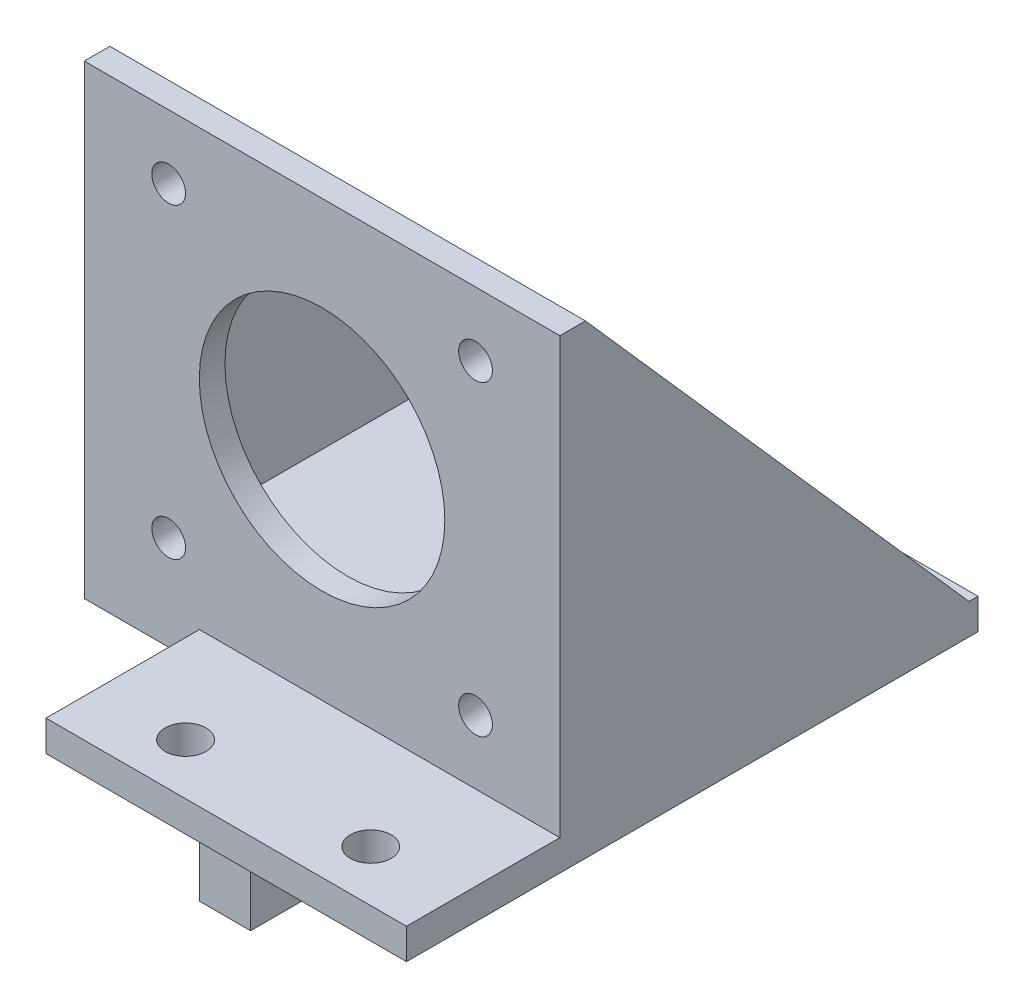
ISO-10303-21;
HEADER;
FILE_DESCRIPTION(('STEP AP214'),'2;1');
FILE_NAME('part.step','',(''),(''),'','','');
FILE_SCHEMA(('AUTOMOTIVE_DESIGN { 1 0 10303 214 1 1 1 1 }'));
ENDSEC;
DATA;
#1=APPLICATION_CONTEXT('core data for automotive mechanical design processes');
#2=APPLICATION_PROTOCOL_DEFINITION('international standard','automotive_design',2000,#1);
#3=PRODUCT_CONTEXT('',#1,'mechanical');
#4=PRODUCT('Part','Part','',(#3));
#5=PRODUCT_RELATED_PRODUCT_CATEGORY('part','',(#4));
#6=PRODUCT_DEFINITION_FORMATION('','',#4);
#7=PRODUCT_DEFINITION_CONTEXT('part definition',#1,'design');
#8=PRODUCT_DEFINITION('design','',#6,#7);
#9=PRODUCT_DEFINITION_SHAPE('','',#8);
#10=(LENGTH_UNIT() NAMED_UNIT(*) SI_UNIT(.MILLI.,.METRE.));
#11=(NAMED_UNIT(*) PLANE_ANGLE_UNIT() SI_UNIT($,.RADIAN.));
#12=(NAMED_UNIT(*) SI_UNIT($,.STERADIAN.) SOLID_ANGLE_UNIT());
#13=UNCERTAINTY_MEASURE_WITH_UNIT(LENGTH_MEASURE(1.E-05),#10,'distance_accuracy_value','');
#14=(GEOMETRIC_REPRESENTATION_CONTEXT(3) GLOBAL_UNCERTAINTY_ASSIGNED_CONTEXT((#13)) GLOBAL_UNIT_ASSIGNED_CONTEXT((#10,
#11,#12)) REPRESENTATION_CONTEXT('',''));
#15=CARTESIAN_POINT('',(0.,0.,0.));
#16=DIRECTION('',(0.,0.,1.));
#17=DIRECTION('',(1.,0.,0.));
#18=AXIS2_PLACEMENT_3D('',#15,#16,#17);
#19=CARTESIAN_POINT('',(0.,0.,0.));
#20=DIRECTION('',(0.,1.,0.));
#21=DIRECTION('',(0.,0.,1.));
#22=AXIS2_PLACEMENT_3D('',#19,#20,#21);
#23=PLANE('',#22);
#24=CARTESIAN_POINT('',(46.0093587866197,0.,9.99999999999999));
#25=DIRECTION('',(0.,1.,0.));
#26=DIRECTION('',(0.,0.,1.));
#27=AXIS2_PLACEMENT_3D('',#24,#25,#26);
#28=CIRCLE('',#27,2.);
#29=CARTESIAN_POINT('',(46.0093587866197,0.,12.));
#30=VERTEX_POINT('',#29);
#31=EDGE_CURVE('E264',#30,#30,#28,.T.);
#32=ORIENTED_EDGE('',*,*,#31,.T.);
#33=EDGE_LOOP('',(#32));
#34=FACE_BOUND('',#33,.T.);
#35=CARTESIAN_POINT('',(27.9041713133239,0.,9.99999999999999));
#36=DIRECTION('',(0.,1.,0.));
#37=DIRECTION('',(0.,0.,1.));
#38=AXIS2_PLACEMENT_3D('',#35,#36,#37);
#39=CIRCLE('',#38,2.);
#40=CARTESIAN_POINT('',(27.9041713133239,0.,12.));
#41=VERTEX_POINT('',#40);
#42=EDGE_CURVE('E239',#41,#41,#39,.T.);
#43=ORIENTED_EDGE('',*,*,#42,.T.);
#44=EDGE_LOOP('',(#43));
#45=FACE_BOUND('',#44,.T.);
#46=DIRECTION('',(0.,0.,1.));
#47=VECTOR('',#46,1.);
#48=CARTESIAN_POINT('',(24.259624399256,0.,-40.8749162367315));
#49=LINE('',#48,#47);
#50=CARTESIAN_POINT('',(24.259624399256,0.,-40.8749162367315));
#51=VERTEX_POINT('',#50);
#52=CARTESIAN_POINT('',(24.259624399256,0.,0.));
#53=VERTEX_POINT('',#52);
#54=EDGE_CURVE('E170',#51,#53,#49,.T.);
#55=ORIENTED_EDGE('',*,*,#54,.F.);
#56=DIRECTION('',(-1.,0.,0.));
#57=VECTOR('',#56,1.);
#58=CARTESIAN_POINT('',(0.,0.,-40.8749162367315));
#59=LINE('',#58,#57);
#60=CARTESIAN_POINT('',(54.5,0.,-40.8749162367315));
#61=VERTEX_POINT('',#60);
#62=EDGE_CURVE('E278',#61,#51,#59,.T.);
#63=ORIENTED_EDGE('',*,*,#62,.F.);
#64=DIRECTION('',(0.,0.,1.));
#65=VECTOR('',#64,1.);
#66=CARTESIAN_POINT('',(54.5,0.,0.));
#67=LINE('',#66,#65);
#68=CARTESIAN_POINT('',(54.5,0.,15.));
#69=VERTEX_POINT('',#68);
#70=EDGE_CURVE('E275',#61,#69,#67,.T.);
#71=ORIENTED_EDGE('',*,*,#70,.T.);
#72=DIRECTION('',(-1.,0.,0.));
#73=VECTOR('',#72,1.);
#74=CARTESIAN_POINT('',(0.,0.,15.));
#75=LINE('',#74,#73);
#76=CARTESIAN_POINT('',(19.259624399256,0.,15.));
#77=VERTEX_POINT('',#76);
#78=EDGE_CURVE('E272',#69,#77,#75,.T.);
#79=ORIENTED_EDGE('',*,*,#78,.T.);
#80=DIRECTION('',(0.,0.,1.));
#81=VECTOR('',#80,1.);
#82=CARTESIAN_POINT('',(19.259624399256,0.,0.));
#83=LINE('',#82,#81);
#84=CARTESIAN_POINT('',(19.259624399256,0.,0.));
#85=VERTEX_POINT('',#84);
#86=EDGE_CURVE('E269',#85,#77,#83,.T.);
#87=ORIENTED_EDGE('',*,*,#86,.F.);
#88=DIRECTION('',(-1.,0.,0.));
#89=VECTOR('',#88,1.);
#90=CARTESIAN_POINT('',(24.259624399256,0.,0.));
#91=LINE('',#90,#89);
#92=EDGE_CURVE('E52',#53,#85,#91,.T.);
#93=ORIENTED_EDGE('',*,*,#92,.F.);
#94=EDGE_LOOP('',(#55,#63,#71,#79,#87,#93));
#95=FACE_BOUND('',#94,.T.);
#96=ADVANCED_FACE('F35',(#34,#45,#95),#23,.F.);
#97=DIRECTION('',(0.,0.,-1.));
#98=VECTOR('',#97,1.);
#99=CARTESIAN_POINT('',(19.259624399256,0.,-40.8749162367315));
#100=LINE('',#99,#98);
#101=CARTESIAN_POINT('',(19.259624399256,0.,-40.8749162367315));
#102=VERTEX_POINT('',#101);
#103=EDGE_CURVE('E167',#85,#102,#100,.T.);
#104=ORIENTED_EDGE('',*,*,#103,.F.);
#105=DIRECTION('',(1.,0.,0.));
#106=VECTOR('',#105,1.);
#107=CARTESIAN_POINT('',(0.,0.,0.));
#108=LINE('',#107,#106);
#109=CARTESIAN_POINT('',(8.,0.,0.));
#110=VERTEX_POINT('',#109);
#111=EDGE_CURVE('E267',#110,#85,#108,.T.);
#112=ORIENTED_EDGE('',*,*,#111,.F.);
#113=DIRECTION('',(0.,0.,-1.));
#114=VECTOR('',#113,1.);
#115=CARTESIAN_POINT('',(8.,0.,0.));
#116=LINE('',#115,#114);
#117=CARTESIAN_POINT('',(8.,0.,-40.8749162367315));
#118=VERTEX_POINT('',#117);
#119=EDGE_CURVE('E244',#110,#118,#116,.T.);
#120=ORIENTED_EDGE('',*,*,#119,.T.);
#121=EDGE_CURVE('E60',#102,#118,#59,.T.);
#122=ORIENTED_EDGE('',*,*,#121,.F.);
#123=EDGE_LOOP('',(#104,#112,#120,#122));
#124=FACE_BOUND('',#123,.T.);
#125=ADVANCED_FACE('F339',(#124),#23,.F.);
#126=CARTESIAN_POINT('',(0.,3.,0.));
#127=DIRECTION('',(0.,1.,0.));
#128=DIRECTION('',(0.,0.,1.));
#129=AXIS2_PLACEMENT_3D('',#126,#127,#128);
#130=PLANE('',#129);
#131=DIRECTION('',(1.,0.,0.));
#132=VECTOR('',#131,1.);
#133=CARTESIAN_POINT('',(0.,3.,0.));
#134=LINE('',#133,#132);
#135=CARTESIAN_POINT('',(19.259624399256,3.,0.));
#136=VERTEX_POINT('',#135);
#137=CARTESIAN_POINT('',(54.5,3.,0.));
#138=VERTEX_POINT('',#137);
#139=EDGE_CURVE('E44',#136,#138,#134,.T.);
#140=ORIENTED_EDGE('',*,*,#139,.F.);
#141=DIRECTION('',(0.,0.,1.));
#142=VECTOR('',#141,1.);
#143=CARTESIAN_POINT('',(19.259624399256,3.,0.));
#144=LINE('',#143,#142);
#145=CARTESIAN_POINT('',(19.259624399256,3.,15.));
#146=VERTEX_POINT('',#145);
#147=EDGE_CURVE('E247',#136,#146,#144,.T.);
#148=ORIENTED_EDGE('',*,*,#147,.T.);
#149=DIRECTION('',(-1.,0.,0.));
#150=VECTOR('',#149,1.);
#151=CARTESIAN_POINT('',(0.,3.,15.));
#152=LINE('',#151,#150);
#153=CARTESIAN_POINT('',(54.5,3.,15.));
#154=VERTEX_POINT('',#153);
#155=EDGE_CURVE('E249',#154,#146,#152,.T.);
#156=ORIENTED_EDGE('',*,*,#155,.F.);
#157=DIRECTION('',(0.,0.,1.));
#158=VECTOR('',#157,1.);
#159=CARTESIAN_POINT('',(54.5,3.,0.));
#160=LINE('',#159,#158);
#161=EDGE_CURVE('E252',#138,#154,#160,.T.);
#162=ORIENTED_EDGE('',*,*,#161,.F.);
#163=EDGE_LOOP('',(#140,#148,#156,#162));
#164=FACE_BOUND('',#163,.T.);
#165=CARTESIAN_POINT('',(27.9041713133239,3.,9.99999999999999));
#166=DIRECTION('',(0.,1.,0.));
#167=DIRECTION('',(0.,0.,1.));
#168=AXIS2_PLACEMENT_3D('',#165,#166,#167);
#169=CIRCLE('',#168,2.);
#170=CARTESIAN_POINT('',(27.9041713133239,3.,12.));
#171=VERTEX_POINT('',#170);
#172=EDGE_CURVE('E240',#171,#171,#169,.T.);
#173=ORIENTED_EDGE('',*,*,#172,.F.);
#174=EDGE_LOOP('',(#173));
#175=FACE_BOUND('',#174,.T.);
#176=CARTESIAN_POINT('',(46.0093587866197,3.,9.99999999999999));
#177=DIRECTION('',(0.,1.,0.));
#178=DIRECTION('',(0.,0.,1.));
#179=AXIS2_PLACEMENT_3D('',#176,#177,#178);
#180=CIRCLE('',#179,2.);
#181=CARTESIAN_POINT('',(46.0093587866197,3.,12.));
#182=VERTEX_POINT('',#181);
#183=EDGE_CURVE('E243',#182,#182,#180,.T.);
#184=ORIENTED_EDGE('',*,*,#183,.F.);
#185=EDGE_LOOP('',(#184));
#186=FACE_BOUND('',#185,.T.);
#187=ADVANCED_FACE('F409',(#164,#175,#186),#130,.T.);
#188=CARTESIAN_POINT('',(0.,3.,0.));
#189=DIRECTION('',(0.,0.,-1.));
#190=DIRECTION('',(-1.,0.,0.));
#191=AXIS2_PLACEMENT_3D('',#188,#189,#190);
#192=PLANE('',#191);
#193=CARTESIAN_POINT('',(16.25,9.25,0.));
#194=DIRECTION('',(0.,0.,1.));
#195=DIRECTION('',(1.,0.,0.));
#196=AXIS2_PLACEMENT_3D('',#193,#194,#195);
#197=CIRCLE('',#196,1.65);
#198=CARTESIAN_POINT('',(17.9,9.25,0.));
#199=VERTEX_POINT('',#198);
#200=EDGE_CURVE('E180',#199,#199,#197,.T.);
#201=ORIENTED_EDGE('',*,*,#200,.F.);
#202=EDGE_LOOP('',(#201));
#203=FACE_BOUND('',#202,.T.);
#204=CARTESIAN_POINT('',(16.25,39.25,0.));
#205=DIRECTION('',(0.,0.,1.));
#206=DIRECTION('',(1.,0.,0.));
#207=AXIS2_PLACEMENT_3D('',#204,#205,#206);
#208=CIRCLE('',#207,1.65);
#209=CARTESIAN_POINT('',(17.9,39.25,0.));
#210=VERTEX_POINT('',#209);
#211=EDGE_CURVE('E184',#210,#210,#208,.T.);
#212=ORIENTED_EDGE('',*,*,#211,.F.);
#213=EDGE_LOOP('',(#212));
#214=FACE_BOUND('',#213,.T.);
#215=CARTESIAN_POINT('',(46.25,39.25,0.));
#216=DIRECTION('',(0.,0.,1.));
#217=DIRECTION('',(1.,0.,0.));
#218=AXIS2_PLACEMENT_3D('',#215,#216,#217);
#219=CIRCLE('',#218,1.65);
#220=CARTESIAN_POINT('',(47.9,39.25,0.));
#221=VERTEX_POINT('',#220);
#222=EDGE_CURVE('E174',#221,#221,#219,.T.);
#223=ORIENTED_EDGE('',*,*,#222,.F.);
#224=EDGE_LOOP('',(#223));
#225=FACE_BOUND('',#224,.T.);
#226=CARTESIAN_POINT('',(46.25,9.25,0.));
#227=DIRECTION('',(0.,0.,1.));
#228=DIRECTION('',(1.,0.,0.));
#229=AXIS2_PLACEMENT_3D('',#226,#227,#228);
#230=CIRCLE('',#229,1.65);
#231=CARTESIAN_POINT('',(47.9,9.25,0.));
#232=VERTEX_POINT('',#231);
#233=EDGE_CURVE('E171',#232,#232,#230,.T.);
#234=ORIENTED_EDGE('',*,*,#233,.F.);
#235=EDGE_LOOP('',(#234));
#236=FACE_BOUND('',#235,.T.);
#237=CARTESIAN_POINT('',(31.25,24.25,0.));
#238=DIRECTION('',(0.,0.,1.));
#239=DIRECTION('',(1.,0.,0.));
#240=AXIS2_PLACEMENT_3D('',#237,#238,#239);
#241=CIRCLE('',#240,12.);
#242=CARTESIAN_POINT('',(43.25,24.25,0.));
#243=VERTEX_POINT('',#242);
#244=EDGE_CURVE('E189',#243,#243,#241,.T.);
#245=ORIENTED_EDGE('',*,*,#244,.F.);
#246=EDGE_LOOP('',(#245));
#247=FACE_BOUND('',#246,.T.);
#248=ORIENTED_EDGE('',*,*,#111,.T.);
#249=DIRECTION('',(0.,-1.,0.));
#250=VECTOR('',#249,1.);
#251=CARTESIAN_POINT('',(19.259624399256,3.,0.));
#252=LINE('',#251,#250);
#253=EDGE_CURVE('E230',#136,#85,#252,.T.);
#254=ORIENTED_EDGE('',*,*,#253,.F.);
#255=ORIENTED_EDGE('',*,*,#139,.T.);
#256=DIRECTION('',(0.,-1.,0.));
#257=VECTOR('',#256,1.);
#258=CARTESIAN_POINT('',(54.5,45.5,0.));
#259=LINE('',#258,#257);
#260=CARTESIAN_POINT('',(54.5,45.5,0.));
#261=VERTEX_POINT('',#260);
#262=EDGE_CURVE('E218',#261,#138,#259,.T.);
#263=ORIENTED_EDGE('',*,*,#262,.F.);
#264=DIRECTION('',(1.,0.,0.));
#265=VECTOR('',#264,1.);
#266=CARTESIAN_POINT('',(0.,45.5,0.));
#267=LINE('',#266,#265);
#268=CARTESIAN_POINT('',(8.,45.5,0.));
#269=VERTEX_POINT('',#268);
#270=EDGE_CURVE('E216',#269,#261,#267,.T.);
#271=ORIENTED_EDGE('',*,*,#270,.F.);
#272=DIRECTION('',(0.,-1.,0.));
#273=VECTOR('',#272,1.);
#274=CARTESIAN_POINT('',(8.,3.,0.));
#275=LINE('',#274,#273);
#276=EDGE_CURVE('E261',#269,#110,#275,.T.);
#277=ORIENTED_EDGE('',*,*,#276,.T.);
#278=EDGE_LOOP('',(#248,#254,#255,#263,#271,#277));
#279=FACE_BOUND('',#278,.T.);
#280=ADVANCED_FACE('F370',(#203,#214,#225,#236,#247,#279),#192,.F.);
#281=CARTESIAN_POINT('',(19.259624399256,3.,0.));
#282=DIRECTION('',(1.,0.,0.));
#283=DIRECTION('',(0.,0.,-1.));
#284=AXIS2_PLACEMENT_3D('',#281,#282,#283);
#285=PLANE('',#284);
#286=ORIENTED_EDGE('',*,*,#86,.T.);
#287=DIRECTION('',(0.,-1.,0.));
#288=VECTOR('',#287,1.);
#289=CARTESIAN_POINT('',(19.259624399256,3.,15.));
#290=LINE('',#289,#288);
#291=EDGE_CURVE('E290',#146,#77,#290,.T.);
#292=ORIENTED_EDGE('',*,*,#291,.F.);
#293=ORIENTED_EDGE('',*,*,#147,.F.);
#294=ORIENTED_EDGE('',*,*,#253,.T.);
#295=EDGE_LOOP('',(#286,#292,#293,#294));
#296=FACE_BOUND('',#295,.T.);
#297=ADVANCED_FACE('F369',(#296),#285,.F.);
#298=CARTESIAN_POINT('',(0.,3.,15.));
#299=DIRECTION('',(0.,0.,1.));
#300=DIRECTION('',(1.,0.,0.));
#301=AXIS2_PLACEMENT_3D('',#298,#299,#300);
#302=PLANE('',#301);
#303=ORIENTED_EDGE('',*,*,#78,.F.);
#304=DIRECTION('',(0.,-1.,0.));
#305=VECTOR('',#304,1.);
#306=CARTESIAN_POINT('',(54.5,3.,15.));
#307=LINE('',#306,#305);
#308=EDGE_CURVE('E288',#154,#69,#307,.T.);
#309=ORIENTED_EDGE('',*,*,#308,.F.);
#310=ORIENTED_EDGE('',*,*,#155,.T.);
#311=ORIENTED_EDGE('',*,*,#291,.T.);
#312=EDGE_LOOP('',(#303,#309,#310,#311));
#313=FACE_BOUND('',#312,.T.);
#314=ADVANCED_FACE('F364',(#313),#302,.T.);
#315=CARTESIAN_POINT('',(54.5,3.,0.));
#316=DIRECTION('',(1.,0.,0.));
#317=DIRECTION('',(0.,0.,-1.));
#318=AXIS2_PLACEMENT_3D('',#315,#316,#317);
#319=PLANE('',#318);
#320=DIRECTION('',(0.,-0.749837855365092,-0.661621637086847));
#321=VECTOR('',#320,1.);
#322=CARTESIAN_POINT('',(54.5,21.1575875486382,-23.9785992217899));
#323=LINE('',#322,#321);
#324=CARTESIAN_POINT('',(54.5,45.5,-2.5));
#325=VERTEX_POINT('',#324);
#326=CARTESIAN_POINT('',(54.5,3.,-40.));
#327=VERTEX_POINT('',#326);
#328=EDGE_CURVE('E198',#325,#327,#323,.T.);
#329=ORIENTED_EDGE('',*,*,#328,.F.);
#330=DIRECTION('',(0.,0.,-1.));
#331=VECTOR('',#330,1.);
#332=CARTESIAN_POINT('',(54.5,45.5,0.));
#333=LINE('',#332,#331);
#334=EDGE_CURVE('E207',#261,#325,#333,.T.);
#335=ORIENTED_EDGE('',*,*,#334,.F.);
#336=ORIENTED_EDGE('',*,*,#262,.T.);
#337=ORIENTED_EDGE('',*,*,#161,.T.);
#338=ORIENTED_EDGE('',*,*,#308,.T.);
#339=ORIENTED_EDGE('',*,*,#70,.F.);
#340=DIRECTION('',(0.,-1.,0.));
#341=VECTOR('',#340,1.);
#342=CARTESIAN_POINT('',(54.5,3.,-40.8749162367315));
#343=LINE('',#342,#341);
#344=CARTESIAN_POINT('',(54.5,3.,-40.8749162367315));
#345=VERTEX_POINT('',#344);
#346=EDGE_CURVE('E286',#345,#61,#343,.T.);
#347=ORIENTED_EDGE('',*,*,#346,.F.);
#348=EDGE_CURVE('E253',#345,#327,#160,.T.);
#349=ORIENTED_EDGE('',*,*,#348,.T.);
#350=EDGE_LOOP('',(#329,#335,#336,#337,#338,#339,#347,#349));
#351=FACE_BOUND('',#350,.T.);
#352=ADVANCED_FACE('F358',(#351),#319,.T.);
#353=CARTESIAN_POINT('',(0.,3.,-40.8749162367315));
#354=DIRECTION('',(0.,0.,1.));
#355=DIRECTION('',(1.,0.,0.));
#356=AXIS2_PLACEMENT_3D('',#353,#354,#355);
#357=PLANE('',#356);
#358=ORIENTED_EDGE('',*,*,#62,.T.);
#359=DIRECTION('',(0.,1.,0.));
#360=VECTOR('',#359,1.);
#361=CARTESIAN_POINT('',(24.259624399256,-20.,-40.8749162367315));
#362=LINE('',#361,#360);
#363=CARTESIAN_POINT('',(24.259624399256,-20.,-40.8749162367315));
#364=VERTEX_POINT('',#363);
#365=EDGE_CURVE('E327',#364,#51,#362,.T.);
#366=ORIENTED_EDGE('',*,*,#365,.F.);
#367=DIRECTION('',(1.,0.,0.));
#368=VECTOR('',#367,1.);
#369=CARTESIAN_POINT('',(24.259624399256,-20.,-40.8749162367315));
#370=LINE('',#369,#368);
#371=CARTESIAN_POINT('',(19.259624399256,-20.,-40.8749162367315));
#372=VERTEX_POINT('',#371);
#373=EDGE_CURVE('E163',#372,#364,#370,.T.);
#374=ORIENTED_EDGE('',*,*,#373,.F.);
#375=DIRECTION('',(0.,1.,0.));
#376=VECTOR('',#375,1.);
#377=CARTESIAN_POINT('',(19.259624399256,-20.,-40.8749162367315));
#378=LINE('',#377,#376);
#379=EDGE_CURVE('E176',#372,#102,#378,.T.);
#380=ORIENTED_EDGE('',*,*,#379,.T.);
#381=ORIENTED_EDGE('',*,*,#121,.T.);
#382=DIRECTION('',(0.,-1.,0.));
#383=VECTOR('',#382,1.);
#384=CARTESIAN_POINT('',(8.,3.,-40.8749162367315));
#385=LINE('',#384,#383);
#386=CARTESIAN_POINT('',(8.,3.,-40.8749162367315));
#387=VERTEX_POINT('',#386);
#388=EDGE_CURVE('E283',#387,#118,#385,.T.);
#389=ORIENTED_EDGE('',*,*,#388,.F.);
#390=DIRECTION('',(-1.,0.,0.));
#391=VECTOR('',#390,1.);
#392=CARTESIAN_POINT('',(0.,3.,-40.8749162367315));
#393=LINE('',#392,#391);
#394=EDGE_CURVE('E256',#345,#387,#393,.T.);
#395=ORIENTED_EDGE('',*,*,#394,.F.);
#396=ORIENTED_EDGE('',*,*,#346,.T.);
#397=EDGE_LOOP('',(#358,#366,#374,#380,#381,#389,#395,#396));
#398=FACE_BOUND('',#397,.T.);
#399=ADVANCED_FACE('F334',(#398),#357,.F.);
#400=CARTESIAN_POINT('',(46.0093587866197,3.,9.99999999999999));
#401=DIRECTION('',(0.,-1.,0.));
#402=DIRECTION('',(0.,0.,-1.));
#403=AXIS2_PLACEMENT_3D('',#400,#401,#402);
#404=CYLINDRICAL_SURFACE('',#403,2.);
#405=ORIENTED_EDGE('',*,*,#183,.T.);
#406=EDGE_LOOP('',(#405));
#407=FACE_BOUND('',#406,.T.);
#408=ORIENTED_EDGE('',*,*,#31,.F.);
#409=EDGE_LOOP('',(#408));
#410=FACE_BOUND('',#409,.T.);
#411=ADVANCED_FACE('F418',(#407,#410),#404,.F.);
#412=CARTESIAN_POINT('',(27.9041713133239,3.,9.99999999999999));
#413=DIRECTION('',(0.,-1.,0.));
#414=DIRECTION('',(0.,0.,-1.));
#415=AXIS2_PLACEMENT_3D('',#412,#413,#414);
#416=CYLINDRICAL_SURFACE('',#415,2.);
#417=ORIENTED_EDGE('',*,*,#172,.T.);
#418=EDGE_LOOP('',(#417));
#419=FACE_BOUND('',#418,.T.);
#420=ORIENTED_EDGE('',*,*,#42,.F.);
#421=EDGE_LOOP('',(#420));
#422=FACE_BOUND('',#421,.T.);
#423=ADVANCED_FACE('F37',(#419,#422),#416,.F.);
#424=CARTESIAN_POINT('',(8.,3.,0.));
#425=DIRECTION('',(-1.,0.,0.));
#426=DIRECTION('',(0.,0.,1.));
#427=AXIS2_PLACEMENT_3D('',#424,#425,#426);
#428=PLANE('',#427);
#429=DIRECTION('',(0.,-0.749837855365092,-0.661621637086847));
#430=VECTOR('',#429,1.);
#431=CARTESIAN_POINT('',(8.,21.1575875486382,-23.9785992217899));
#432=LINE('',#431,#430);
#433=CARTESIAN_POINT('',(8.,45.5,-2.5));
#434=VERTEX_POINT('',#433);
#435=CARTESIAN_POINT('',(8.,3.,-40.));
#436=VERTEX_POINT('',#435);
#437=EDGE_CURVE('E194',#434,#436,#432,.T.);
#438=ORIENTED_EDGE('',*,*,#437,.T.);
#439=DIRECTION('',(0.,0.,-1.));
#440=VECTOR('',#439,1.);
#441=CARTESIAN_POINT('',(8.,3.,0.));
#442=LINE('',#441,#440);
#443=EDGE_CURVE('E259',#436,#387,#442,.T.);
#444=ORIENTED_EDGE('',*,*,#443,.T.);
#445=ORIENTED_EDGE('',*,*,#388,.T.);
#446=ORIENTED_EDGE('',*,*,#119,.F.);
#447=ORIENTED_EDGE('',*,*,#276,.F.);
#448=DIRECTION('',(0.,0.,1.));
#449=VECTOR('',#448,1.);
#450=CARTESIAN_POINT('',(8.,45.5,0.));
#451=LINE('',#450,#449);
#452=EDGE_CURVE('E214',#434,#269,#451,.T.);
#453=ORIENTED_EDGE('',*,*,#452,.F.);
#454=EDGE_LOOP('',(#438,#444,#445,#446,#447,#453));
#455=FACE_BOUND('',#454,.T.);
#456=ADVANCED_FACE('F345',(#455),#428,.T.);
#457=DIRECTION('',(0.,0.,1.));
#458=VECTOR('',#457,1.);
#459=CARTESIAN_POINT('',(52.5,3.,0.));
#460=LINE('',#459,#458);
#461=CARTESIAN_POINT('',(52.5,3.,-40.));
#462=VERTEX_POINT('',#461);
#463=CARTESIAN_POINT('',(52.5,3.,-2.5));
#464=VERTEX_POINT('',#463);
#465=EDGE_CURVE('E220',#462,#464,#460,.T.);
#466=ORIENTED_EDGE('',*,*,#465,.F.);
#467=DIRECTION('',(-1.,0.,0.));
#468=VECTOR('',#467,1.);
#469=CARTESIAN_POINT('',(0.,3.,-40.));
#470=LINE('',#469,#468);
#471=EDGE_CURVE('E206',#327,#462,#470,.T.);
#472=ORIENTED_EDGE('',*,*,#471,.F.);
#473=ORIENTED_EDGE('',*,*,#348,.F.);
#474=ORIENTED_EDGE('',*,*,#394,.T.);
#475=ORIENTED_EDGE('',*,*,#443,.F.);
#476=DIRECTION('',(-1.,0.,0.));
#477=VECTOR('',#476,1.);
#478=CARTESIAN_POINT('',(0.,3.,-40.));
#479=LINE('',#478,#477);
#480=CARTESIAN_POINT('',(10.,3.,-40.));
#481=VERTEX_POINT('',#480);
#482=EDGE_CURVE('E211',#481,#436,#479,.T.);
#483=ORIENTED_EDGE('',*,*,#482,.F.);
#484=DIRECTION('',(0.,0.,1.));
#485=VECTOR('',#484,1.);
#486=CARTESIAN_POINT('',(10.,3.,0.));
#487=LINE('',#486,#485);
#488=CARTESIAN_POINT('',(10.,3.,-2.5));
#489=VERTEX_POINT('',#488);
#490=EDGE_CURVE('E225',#481,#489,#487,.T.);
#491=ORIENTED_EDGE('',*,*,#490,.T.);
#492=DIRECTION('',(1.,0.,0.));
#493=VECTOR('',#492,1.);
#494=CARTESIAN_POINT('',(0.,3.,-2.5));
#495=LINE('',#494,#493);
#496=EDGE_CURVE('E223',#489,#464,#495,.T.);
#497=ORIENTED_EDGE('',*,*,#496,.T.);
#498=EDGE_LOOP('',(#466,#472,#473,#474,#475,#483,#491,#497));
#499=FACE_BOUND('',#498,.T.);
#500=ADVANCED_FACE('F355',(#499),#130,.T.);
#501=CARTESIAN_POINT('',(52.5,45.5,0.));
#502=DIRECTION('',(1.,0.,0.));
#503=DIRECTION('',(0.,0.,-1.));
#504=AXIS2_PLACEMENT_3D('',#501,#502,#503);
#505=PLANE('',#504);
#506=DIRECTION('',(0.,-1.,0.));
#507=VECTOR('',#506,1.);
#508=CARTESIAN_POINT('',(52.5,45.5,-2.5));
#509=LINE('',#508,#507);
#510=CARTESIAN_POINT('',(52.5,45.5,-2.5));
#511=VERTEX_POINT('',#510);
#512=EDGE_CURVE('E236',#511,#464,#509,.T.);
#513=ORIENTED_EDGE('',*,*,#512,.F.);
#514=DIRECTION('',(0.,-0.749837855365092,-0.661621637086847));
#515=VECTOR('',#514,1.);
#516=CARTESIAN_POINT('',(52.5,46.7402723735409,-1.4056420233463));
#517=LINE('',#516,#515);
#518=EDGE_CURVE('E203',#511,#462,#517,.T.);
#519=ORIENTED_EDGE('',*,*,#518,.T.);
#520=ORIENTED_EDGE('',*,*,#465,.T.);
#521=EDGE_LOOP('',(#513,#519,#520));
#522=FACE_BOUND('',#521,.T.);
#523=ADVANCED_FACE('F390',(#522),#505,.F.);
#524=CARTESIAN_POINT('',(0.,45.5,-2.5));
#525=DIRECTION('',(0.,0.,-1.));
#526=DIRECTION('',(-1.,0.,0.));
#527=AXIS2_PLACEMENT_3D('',#524,#525,#526);
#528=PLANE('',#527);
#529=CARTESIAN_POINT('',(16.25,9.25,-2.5));
#530=DIRECTION('',(0.,0.,-1.));
#531=DIRECTION('',(-1.,0.,0.));
#532=AXIS2_PLACEMENT_3D('',#529,#530,#531);
#533=CIRCLE('',#532,1.65);
#534=CARTESIAN_POINT('',(14.6,9.25,-2.5));
#535=VERTEX_POINT('',#534);
#536=EDGE_CURVE('E193',#535,#535,#533,.T.);
#537=ORIENTED_EDGE('',*,*,#536,.F.);
#538=EDGE_LOOP('',(#537));
#539=FACE_BOUND('',#538,.T.);
#540=CARTESIAN_POINT('',(16.25,39.25,-2.5));
#541=DIRECTION('',(0.,0.,-1.));
#542=DIRECTION('',(-1.,0.,0.));
#543=AXIS2_PLACEMENT_3D('',#540,#541,#542);
#544=CIRCLE('',#543,1.65);
#545=CARTESIAN_POINT('',(14.6,39.25,-2.5));
#546=VERTEX_POINT('',#545);
#547=EDGE_CURVE('E301',#546,#546,#544,.T.);
#548=ORIENTED_EDGE('',*,*,#547,.F.);
#549=EDGE_LOOP('',(#548));
#550=FACE_BOUND('',#549,.T.);
#551=CARTESIAN_POINT('',(46.25,39.25,-2.5));
#552=DIRECTION('',(0.,0.,-1.));
#553=DIRECTION('',(-1.,0.,0.));
#554=AXIS2_PLACEMENT_3D('',#551,#552,#553);
#555=CIRCLE('',#554,1.65);
#556=CARTESIAN_POINT('',(44.6,39.25,-2.5));
#557=VERTEX_POINT('',#556);
#558=EDGE_CURVE('E298',#557,#557,#555,.T.);
#559=ORIENTED_EDGE('',*,*,#558,.F.);
#560=EDGE_LOOP('',(#559));
#561=FACE_BOUND('',#560,.T.);
#562=CARTESIAN_POINT('',(46.25,9.25,-2.5));
#563=DIRECTION('',(0.,0.,-1.));
#564=DIRECTION('',(-1.,0.,0.));
#565=AXIS2_PLACEMENT_3D('',#562,#563,#564);
#566=CIRCLE('',#565,1.65);
#567=CARTESIAN_POINT('',(44.6,9.25,-2.5));
#568=VERTEX_POINT('',#567);
#569=EDGE_CURVE('E183',#568,#568,#566,.T.);
#570=ORIENTED_EDGE('',*,*,#569,.F.);
#571=EDGE_LOOP('',(#570));
#572=FACE_BOUND('',#571,.T.);
#573=CARTESIAN_POINT('',(31.25,24.25,-2.5));
#574=DIRECTION('',(0.,0.,-1.));
#575=DIRECTION('',(-1.,0.,0.));
#576=AXIS2_PLACEMENT_3D('',#573,#574,#575);
#577=CIRCLE('',#576,12.);
#578=CARTESIAN_POINT('',(19.25,24.25,-2.5));
#579=VERTEX_POINT('',#578);
#580=EDGE_CURVE('E192',#579,#579,#577,.T.);
#581=ORIENTED_EDGE('',*,*,#580,.F.);
#582=EDGE_LOOP('',(#581));
#583=FACE_BOUND('',#582,.T.);
#584=ORIENTED_EDGE('',*,*,#496,.F.);
#585=DIRECTION('',(0.,-1.,0.));
#586=VECTOR('',#585,1.);
#587=CARTESIAN_POINT('',(10.,45.5,-2.5));
#588=LINE('',#587,#586);
#589=CARTESIAN_POINT('',(10.,45.5,-2.5));
#590=VERTEX_POINT('',#589);
#591=EDGE_CURVE('E233',#590,#489,#588,.T.);
#592=ORIENTED_EDGE('',*,*,#591,.F.);
#593=DIRECTION('',(1.,0.,0.));
#594=VECTOR('',#593,1.);
#595=CARTESIAN_POINT('',(0.,45.5,-2.5));
#596=LINE('',#595,#594);
#597=EDGE_CURVE('E210',#590,#511,#596,.T.);
#598=ORIENTED_EDGE('',*,*,#597,.T.);
#599=ORIENTED_EDGE('',*,*,#512,.T.);
#600=EDGE_LOOP('',(#584,#592,#598,#599));
#601=FACE_BOUND('',#600,.T.);
#602=ADVANCED_FACE('F388',(#539,#550,#561,#572,#583,#601),#528,.T.);
#603=CARTESIAN_POINT('',(10.,45.5,0.));
#604=DIRECTION('',(1.,0.,0.));
#605=DIRECTION('',(0.,0.,-1.));
#606=AXIS2_PLACEMENT_3D('',#603,#604,#605);
#607=PLANE('',#606);
#608=DIRECTION('',(0.,-0.749837855365092,-0.661621637086847));
#609=VECTOR('',#608,1.);
#610=CARTESIAN_POINT('',(10.,46.7402723735409,-1.4056420233463));
#611=LINE('',#610,#609);
#612=EDGE_CURVE('E201',#590,#481,#611,.T.);
#613=ORIENTED_EDGE('',*,*,#612,.F.);
#614=ORIENTED_EDGE('',*,*,#591,.T.);
#615=ORIENTED_EDGE('',*,*,#490,.F.);
#616=EDGE_LOOP('',(#613,#614,#615));
#617=FACE_BOUND('',#616,.T.);
#618=ADVANCED_FACE('F384',(#617),#607,.T.);
#619=CARTESIAN_POINT('',(0.,45.5,0.));
#620=DIRECTION('',(0.,1.,0.));
#621=DIRECTION('',(0.,0.,1.));
#622=AXIS2_PLACEMENT_3D('',#619,#620,#621);
#623=PLANE('',#622);
#624=DIRECTION('',(1.,0.,0.));
#625=VECTOR('',#624,1.);
#626=CARTESIAN_POINT('',(8.,45.5,-2.5));
#627=LINE('',#626,#625);
#628=EDGE_CURVE('E197',#434,#590,#627,.T.);
#629=ORIENTED_EDGE('',*,*,#628,.F.);
#630=ORIENTED_EDGE('',*,*,#452,.T.);
#631=ORIENTED_EDGE('',*,*,#270,.T.);
#632=ORIENTED_EDGE('',*,*,#334,.T.);
#633=DIRECTION('',(1.,0.,0.));
#634=VECTOR('',#633,1.);
#635=CARTESIAN_POINT('',(0.,45.5,-2.49999999999999));
#636=LINE('',#635,#634);
#637=EDGE_CURVE('E11',#511,#325,#636,.T.);
#638=ORIENTED_EDGE('',*,*,#637,.F.);
#639=ORIENTED_EDGE('',*,*,#597,.F.);
#640=EDGE_LOOP('',(#629,#630,#631,#632,#638,#639));
#641=FACE_BOUND('',#640,.T.);
#642=ADVANCED_FACE('F376',(#641),#623,.T.);
#643=CARTESIAN_POINT('',(8.,21.1575875486382,-23.9785992217899));
#644=DIRECTION('',(0.,-0.661621637086847,0.749837855365092));
#645=DIRECTION('',(0.,-0.749837855365092,-0.661621637086847));
#646=AXIS2_PLACEMENT_3D('',#643,#644,#645);
#647=PLANE('',#646);
#648=ORIENTED_EDGE('',*,*,#637,.T.);
#649=ORIENTED_EDGE('',*,*,#328,.T.);
#650=ORIENTED_EDGE('',*,*,#471,.T.);
#651=ORIENTED_EDGE('',*,*,#518,.F.);
#652=EDGE_LOOP('',(#648,#649,#650,#651));
#653=FACE_BOUND('',#652,.T.);
#654=ADVANCED_FACE('F392',(#653),#647,.F.);
#655=ORIENTED_EDGE('',*,*,#612,.T.);
#656=ORIENTED_EDGE('',*,*,#482,.T.);
#657=ORIENTED_EDGE('',*,*,#437,.F.);
#658=ORIENTED_EDGE('',*,*,#628,.T.);
#659=EDGE_LOOP('',(#655,#656,#657,#658));
#660=FACE_BOUND('',#659,.T.);
#661=ADVANCED_FACE('F394',(#660),#647,.F.);
#662=CARTESIAN_POINT('',(31.25,24.25,-40.8749162367315));
#663=DIRECTION('',(0.,0.,1.));
#664=DIRECTION('',(1.,0.,0.));
#665=AXIS2_PLACEMENT_3D('',#662,#663,#664);
#666=CYLINDRICAL_SURFACE('',#665,12.);
#667=ORIENTED_EDGE('',*,*,#580,.T.);
#668=EDGE_LOOP('',(#667));
#669=FACE_BOUND('',#668,.T.);
#670=ORIENTED_EDGE('',*,*,#244,.T.);
#671=EDGE_LOOP('',(#670));
#672=FACE_BOUND('',#671,.T.);
#673=ADVANCED_FACE('F400',(#669,#672),#666,.F.);
#674=CARTESIAN_POINT('',(46.25,9.25,-40.8749162367315));
#675=DIRECTION('',(0.,0.,1.));
#676=DIRECTION('',(1.,0.,0.));
#677=AXIS2_PLACEMENT_3D('',#674,#675,#676);
#678=CYLINDRICAL_SURFACE('',#677,1.65);
#679=ORIENTED_EDGE('',*,*,#569,.T.);
#680=EDGE_LOOP('',(#679));
#681=FACE_BOUND('',#680,.T.);
#682=ORIENTED_EDGE('',*,*,#233,.T.);
#683=EDGE_LOOP('',(#682));
#684=FACE_BOUND('',#683,.T.);
#685=ADVANCED_FACE('F493',(#681,#684),#678,.F.);
#686=CARTESIAN_POINT('',(46.25,39.25,-40.8749162367315));
#687=DIRECTION('',(0.,0.,1.));
#688=DIRECTION('',(1.,0.,0.));
#689=AXIS2_PLACEMENT_3D('',#686,#687,#688);
#690=CYLINDRICAL_SURFACE('',#689,1.65);
#691=ORIENTED_EDGE('',*,*,#558,.T.);
#692=EDGE_LOOP('',(#691));
#693=FACE_BOUND('',#692,.T.);
#694=ORIENTED_EDGE('',*,*,#222,.T.);
#695=EDGE_LOOP('',(#694));
#696=FACE_BOUND('',#695,.T.);
#697=ADVANCED_FACE('F502',(#693,#696),#690,.F.);
#698=CARTESIAN_POINT('',(16.25,39.25,-40.8749162367315));
#699=DIRECTION('',(0.,0.,1.));
#700=DIRECTION('',(1.,0.,0.));
#701=AXIS2_PLACEMENT_3D('',#698,#699,#700);
#702=CYLINDRICAL_SURFACE('',#701,1.65);
#703=ORIENTED_EDGE('',*,*,#547,.T.);
#704=EDGE_LOOP('',(#703));
#705=FACE_BOUND('',#704,.T.);
#706=ORIENTED_EDGE('',*,*,#211,.T.);
#707=EDGE_LOOP('',(#706));
#708=FACE_BOUND('',#707,.T.);
#709=ADVANCED_FACE('F512',(#705,#708),#702,.F.);
#710=CARTESIAN_POINT('',(16.25,9.25,-40.8749162367315));
#711=DIRECTION('',(0.,0.,1.));
#712=DIRECTION('',(1.,0.,0.));
#713=AXIS2_PLACEMENT_3D('',#710,#711,#712);
#714=CYLINDRICAL_SURFACE('',#713,1.65);
#715=ORIENTED_EDGE('',*,*,#536,.T.);
#716=EDGE_LOOP('',(#715));
#717=FACE_BOUND('',#716,.T.);
#718=ORIENTED_EDGE('',*,*,#200,.T.);
#719=EDGE_LOOP('',(#718));
#720=FACE_BOUND('',#719,.T.);
#721=ADVANCED_FACE('F522',(#717,#720),#714,.F.);
#722=CARTESIAN_POINT('',(24.259624399256,-20.,-40.8749162367315));
#723=DIRECTION('',(-1.,0.,0.));
#724=DIRECTION('',(0.,0.,1.));
#725=AXIS2_PLACEMENT_3D('',#722,#723,#724);
#726=PLANE('',#725);
#727=CARTESIAN_POINT('',(24.259624399256,-10.,-20.));
#728=DIRECTION('',(1.,0.,0.));
#729=DIRECTION('',(0.,0.,-1.));
#730=AXIS2_PLACEMENT_3D('',#727,#728,#729);
#731=CIRCLE('',#730,2.025);
#732=CARTESIAN_POINT('',(24.259624399256,-10.,-22.025));
#733=VERTEX_POINT('',#732);
#734=EDGE_CURVE('E311',#733,#733,#731,.T.);
#735=ORIENTED_EDGE('',*,*,#734,.F.);
#736=EDGE_LOOP('',(#735));
#737=FACE_BOUND('',#736,.T.);
#738=CARTESIAN_POINT('',(24.259624399256,-10.,-5.));
#739=DIRECTION('',(1.,0.,0.));
#740=DIRECTION('',(0.,0.,-1.));
#741=AXIS2_PLACEMENT_3D('',#738,#739,#740);
#742=CIRCLE('',#741,2.025);
#743=CARTESIAN_POINT('',(24.259624399256,-10.,-7.025));
#744=VERTEX_POINT('',#743);
#745=EDGE_CURVE('E316',#744,#744,#742,.T.);
#746=ORIENTED_EDGE('',*,*,#745,.F.);
#747=EDGE_LOOP('',(#746));
#748=FACE_BOUND('',#747,.T.);
#749=CARTESIAN_POINT('',(24.259624399256,-10.,-35.));
#750=DIRECTION('',(1.,0.,0.));
#751=DIRECTION('',(0.,0.,-1.));
#752=AXIS2_PLACEMENT_3D('',#749,#750,#751);
#753=CIRCLE('',#752,2.025);
#754=CARTESIAN_POINT('',(24.259624399256,-10.,-37.025));
#755=VERTEX_POINT('',#754);
#756=EDGE_CURVE('E308',#755,#755,#753,.T.);
#757=ORIENTED_EDGE('',*,*,#756,.F.);
#758=EDGE_LOOP('',(#757));
#759=FACE_BOUND('',#758,.T.);
#760=ORIENTED_EDGE('',*,*,#54,.T.);
#761=DIRECTION('',(0.,1.,0.));
#762=VECTOR('',#761,1.);
#763=CARTESIAN_POINT('',(24.259624399256,-20.,0.));
#764=LINE('',#763,#762);
#765=CARTESIAN_POINT('',(24.259624399256,-20.,0.));
#766=VERTEX_POINT('',#765);
#767=EDGE_CURVE('E151',#766,#53,#764,.T.);
#768=ORIENTED_EDGE('',*,*,#767,.F.);
#769=DIRECTION('',(0.,0.,1.));
#770=VECTOR('',#769,1.);
#771=CARTESIAN_POINT('',(24.259624399256,-20.,-40.8749162367315));
#772=LINE('',#771,#770);
#773=EDGE_CURVE('E158',#364,#766,#772,.T.);
#774=ORIENTED_EDGE('',*,*,#773,.F.);
#775=ORIENTED_EDGE('',*,*,#365,.T.);
#776=EDGE_LOOP('',(#760,#768,#774,#775));
#777=FACE_BOUND('',#776,.T.);
#778=ADVANCED_FACE('F169',(#737,#748,#759,#777),#726,.F.);
#779=CARTESIAN_POINT('',(24.259624399256,-20.,0.));
#780=DIRECTION('',(0.,0.,-1.));
#781=DIRECTION('',(-1.,0.,0.));
#782=AXIS2_PLACEMENT_3D('',#779,#780,#781);
#783=PLANE('',#782);
#784=ORIENTED_EDGE('',*,*,#92,.T.);
#785=DIRECTION('',(0.,1.,0.));
#786=VECTOR('',#785,1.);
#787=CARTESIAN_POINT('',(19.259624399256,-20.,0.));
#788=LINE('',#787,#786);
#789=CARTESIAN_POINT('',(19.259624399256,-20.,0.));
#790=VERTEX_POINT('',#789);
#791=EDGE_CURVE('E154',#790,#85,#788,.T.);
#792=ORIENTED_EDGE('',*,*,#791,.F.);
#793=DIRECTION('',(-1.,0.,0.));
#794=VECTOR('',#793,1.);
#795=CARTESIAN_POINT('',(24.259624399256,-20.,0.));
#796=LINE('',#795,#794);
#797=EDGE_CURVE('E147',#766,#790,#796,.T.);
#798=ORIENTED_EDGE('',*,*,#797,.F.);
#799=ORIENTED_EDGE('',*,*,#767,.T.);
#800=EDGE_LOOP('',(#784,#792,#798,#799));
#801=FACE_BOUND('',#800,.T.);
#802=ADVANCED_FACE('F149',(#801),#783,.F.);
#803=CARTESIAN_POINT('',(19.259624399256,-20.,-40.8749162367315));
#804=DIRECTION('',(1.,0.,0.));
#805=DIRECTION('',(0.,0.,-1.));
#806=AXIS2_PLACEMENT_3D('',#803,#804,#805);
#807=PLANE('',#806);
#808=CARTESIAN_POINT('',(19.259624399256,-10.,-20.));
#809=DIRECTION('',(1.,0.,0.));
#810=DIRECTION('',(0.,0.,-1.));
#811=AXIS2_PLACEMENT_3D('',#808,#809,#810);
#812=CIRCLE('',#811,2.025);
#813=CARTESIAN_POINT('',(19.259624399256,-10.,-22.025));
#814=VERTEX_POINT('',#813);
#815=EDGE_CURVE('E39',#814,#814,#812,.T.);
#816=ORIENTED_EDGE('',*,*,#815,.T.);
#817=EDGE_LOOP('',(#816));
#818=FACE_BOUND('',#817,.T.);
#819=CARTESIAN_POINT('',(19.259624399256,-10.,-5.));
#820=DIRECTION('',(1.,0.,0.));
#821=DIRECTION('',(0.,0.,-1.));
#822=AXIS2_PLACEMENT_3D('',#819,#820,#821);
#823=CIRCLE('',#822,2.025);
#824=CARTESIAN_POINT('',(19.259624399256,-10.,-7.025));
#825=VERTEX_POINT('',#824);
#826=EDGE_CURVE('E309',#825,#825,#823,.T.);
#827=ORIENTED_EDGE('',*,*,#826,.T.);
#828=EDGE_LOOP('',(#827));
#829=FACE_BOUND('',#828,.T.);
#830=CARTESIAN_POINT('',(19.259624399256,-10.,-35.));
#831=DIRECTION('',(1.,0.,0.));
#832=DIRECTION('',(0.,0.,-1.));
#833=AXIS2_PLACEMENT_3D('',#830,#831,#832);
#834=CIRCLE('',#833,2.025);
#835=CARTESIAN_POINT('',(19.259624399256,-10.,-37.025));
#836=VERTEX_POINT('',#835);
#837=EDGE_CURVE('E306',#836,#836,#834,.T.);
#838=ORIENTED_EDGE('',*,*,#837,.T.);
#839=EDGE_LOOP('',(#838));
#840=FACE_BOUND('',#839,.T.);
#841=ORIENTED_EDGE('',*,*,#103,.T.);
#842=ORIENTED_EDGE('',*,*,#379,.F.);
#843=DIRECTION('',(0.,0.,-1.));
#844=VECTOR('',#843,1.);
#845=CARTESIAN_POINT('',(19.259624399256,-20.,-40.8749162367315));
#846=LINE('',#845,#844);
#847=EDGE_CURVE('E157',#790,#372,#846,.T.);
#848=ORIENTED_EDGE('',*,*,#847,.F.);
#849=ORIENTED_EDGE('',*,*,#791,.T.);
#850=EDGE_LOOP('',(#841,#842,#848,#849));
#851=FACE_BOUND('',#850,.T.);
#852=ADVANCED_FACE('F337',(#818,#829,#840,#851),#807,.F.);
#853=CARTESIAN_POINT('',(0.,-20.,0.));
#854=DIRECTION('',(0.,-1.,0.));
#855=DIRECTION('',(0.,0.,-1.));
#856=AXIS2_PLACEMENT_3D('',#853,#854,#855);
#857=PLANE('',#856);
#858=ORIENTED_EDGE('',*,*,#773,.T.);
#859=ORIENTED_EDGE('',*,*,#797,.T.);
#860=ORIENTED_EDGE('',*,*,#847,.T.);
#861=ORIENTED_EDGE('',*,*,#373,.T.);
#862=EDGE_LOOP('',(#858,#859,#860,#861));
#863=FACE_BOUND('',#862,.T.);
#864=ADVANCED_FACE('F161',(#863),#857,.T.);
#865=CARTESIAN_POINT('',(8.,-10.,-35.));
#866=DIRECTION('',(1.,0.,0.));
#867=DIRECTION('',(0.,0.,-1.));
#868=AXIS2_PLACEMENT_3D('',#865,#866,#867);
#869=CYLINDRICAL_SURFACE('',#868,2.025);
#870=ORIENTED_EDGE('',*,*,#756,.T.);
#871=EDGE_LOOP('',(#870));
#872=FACE_BOUND('',#871,.T.);
#873=ORIENTED_EDGE('',*,*,#837,.F.);
#874=EDGE_LOOP('',(#873));
#875=FACE_BOUND('',#874,.T.);
#876=ADVANCED_FACE('F570',(#872,#875),#869,.F.);
#877=CARTESIAN_POINT('',(8.,-10.,-5.));
#878=DIRECTION('',(1.,0.,0.));
#879=DIRECTION('',(0.,0.,-1.));
#880=AXIS2_PLACEMENT_3D('',#877,#878,#879);
#881=CYLINDRICAL_SURFACE('',#880,2.025);
#882=ORIENTED_EDGE('',*,*,#745,.T.);
#883=EDGE_LOOP('',(#882));
#884=FACE_BOUND('',#883,.T.);
#885=ORIENTED_EDGE('',*,*,#826,.F.);
#886=EDGE_LOOP('',(#885));
#887=FACE_BOUND('',#886,.T.);
#888=ADVANCED_FACE('F593',(#884,#887),#881,.F.);
#889=CARTESIAN_POINT('',(8.,-10.,-20.));
#890=DIRECTION('',(1.,0.,0.));
#891=DIRECTION('',(0.,0.,-1.));
#892=AXIS2_PLACEMENT_3D('',#889,#890,#891);
#893=CYLINDRICAL_SURFACE('',#892,2.025);
#894=ORIENTED_EDGE('',*,*,#734,.T.);
#895=EDGE_LOOP('',(#894));
#896=FACE_BOUND('',#895,.T.);
#897=ORIENTED_EDGE('',*,*,#815,.F.);
#898=EDGE_LOOP('',(#897));
#899=FACE_BOUND('',#898,.T.);
#900=ADVANCED_FACE('F603',(#896,#899),#893,.F.);
#901=CLOSED_SHELL('',(#96,#125,#187,#280,#297,#314,#352,#399,#411,#423,#456,#500,#523,#602,#618,
#642,#654,#661,#673,#685,#697,#709,#721,#778,#802,#852,#864,#876,#888,#900));
#902=MANIFOLD_SOLID_BREP('B2',#901);
#903=ADVANCED_BREP_SHAPE_REPRESENTATION('',(#18,#902),#14);
#904=SHAPE_DEFINITION_REPRESENTATION(#9,#903);
ENDSEC;
END-ISO-10303-21;
